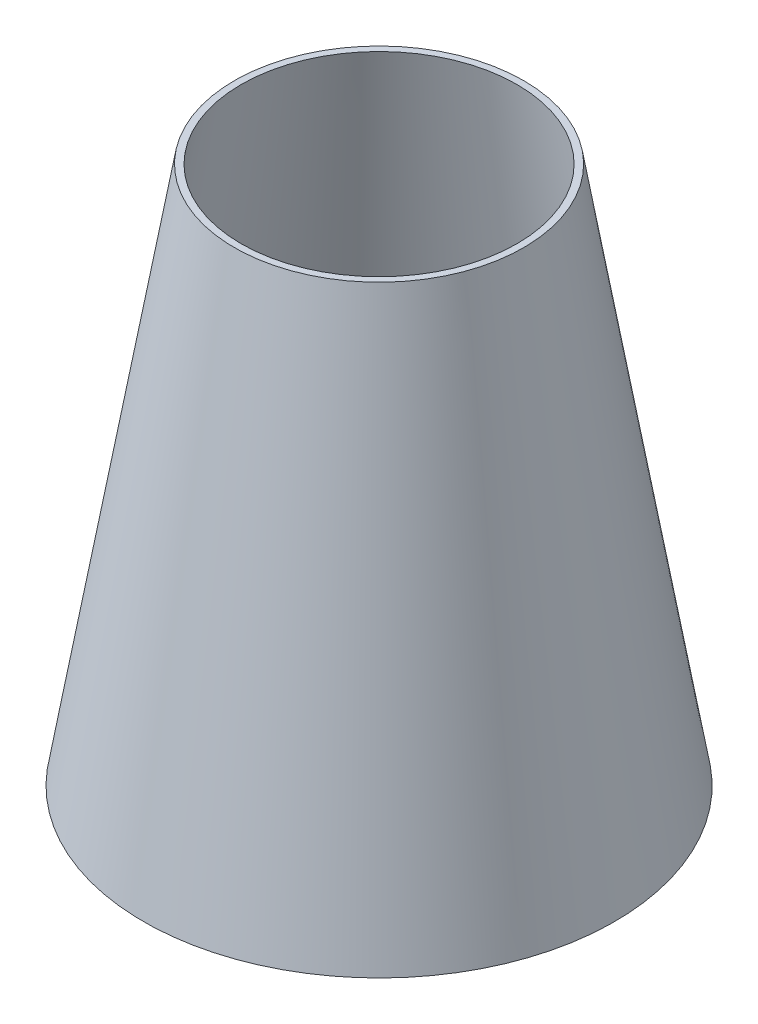
ISO-10303-21;
HEADER;
FILE_DESCRIPTION(('STEP AP214'),'2;1');
FILE_NAME('part.step','',(''),(''),'','','');
FILE_SCHEMA(('AUTOMOTIVE_DESIGN { 1 0 10303 214 1 1 1 1 }'));
ENDSEC;
DATA;
#1=APPLICATION_CONTEXT('core data for automotive mechanical design processes');
#2=APPLICATION_PROTOCOL_DEFINITION('international standard','automotive_design',2000,#1);
#3=PRODUCT_CONTEXT('',#1,'mechanical');
#4=PRODUCT('Part','Part','',(#3));
#5=PRODUCT_RELATED_PRODUCT_CATEGORY('part','',(#4));
#6=PRODUCT_DEFINITION_FORMATION('','',#4);
#7=PRODUCT_DEFINITION_CONTEXT('part definition',#1,'design');
#8=PRODUCT_DEFINITION('design','',#6,#7);
#9=PRODUCT_DEFINITION_SHAPE('','',#8);
#10=(LENGTH_UNIT() NAMED_UNIT(*) SI_UNIT(.MILLI.,.METRE.));
#11=(NAMED_UNIT(*) PLANE_ANGLE_UNIT() SI_UNIT($,.RADIAN.));
#12=(NAMED_UNIT(*) SI_UNIT($,.STERADIAN.) SOLID_ANGLE_UNIT());
#13=UNCERTAINTY_MEASURE_WITH_UNIT(LENGTH_MEASURE(1.E-05),#10,'distance_accuracy_value','');
#14=(GEOMETRIC_REPRESENTATION_CONTEXT(3) GLOBAL_UNCERTAINTY_ASSIGNED_CONTEXT((#13)) GLOBAL_UNIT_ASSIGNED_CONTEXT((#10,
#11,#12)) REPRESENTATION_CONTEXT('',''));
#15=CARTESIAN_POINT('',(0.,0.,0.));
#16=DIRECTION('',(0.,0.,1.));
#17=DIRECTION('',(1.,0.,0.));
#18=AXIS2_PLACEMENT_3D('',#15,#16,#17);
#19=CARTESIAN_POINT('',(-34.,0.,0.));
#20=DIRECTION('',(0.,-1.,0.));
#21=DIRECTION('',(0.,0.,-1.));
#22=AXIS2_PLACEMENT_3D('',#19,#20,#21);
#23=PLANE('',#22);
#24=CARTESIAN_POINT('',(0.,0.,0.));
#25=DIRECTION('',(0.,-1.,0.));
#26=DIRECTION('',(0.,0.,-1.));
#27=AXIS2_PLACEMENT_3D('',#24,#25,#26);
#28=CIRCLE('',#27,35.);
#29=CARTESIAN_POINT('',(0.,0.,-35.));
#30=VERTEX_POINT('',#29);
#31=EDGE_CURVE('E10',#30,#30,#28,.T.);
#32=ORIENTED_EDGE('',*,*,#31,.T.);
#33=EDGE_LOOP('',(#32));
#34=FACE_BOUND('',#33,.T.);
#35=CARTESIAN_POINT('',(0.,0.,0.));
#36=DIRECTION('',(0.,-1.,0.));
#37=DIRECTION('',(0.,0.,-1.));
#38=AXIS2_PLACEMENT_3D('',#35,#36,#37);
#39=CIRCLE('',#38,34.);
#40=CARTESIAN_POINT('',(0.,0.,-34.));
#41=VERTEX_POINT('',#40);
#42=EDGE_CURVE('E46',#41,#41,#39,.T.);
#43=ORIENTED_EDGE('',*,*,#42,.F.);
#44=EDGE_LOOP('',(#43));
#45=FACE_BOUND('',#44,.T.);
#46=ADVANCED_FACE('F32',(#34,#45),#23,.T.);
#47=CARTESIAN_POINT('',(0.,0.,0.));
#48=DIRECTION('',(0.,-1.,0.));
#49=DIRECTION('',(0.,0.,-1.));
#50=AXIS2_PLACEMENT_3D('',#47,#48,#49);
#51=CONICAL_SURFACE('',#50,35.,0.167175017093078);
#52=CARTESIAN_POINT('',(0.,80.,0.));
#53=DIRECTION('',(0.,-1.,0.));
#54=DIRECTION('',(0.,0.,-1.));
#55=AXIS2_PLACEMENT_3D('',#52,#53,#54);
#56=CIRCLE('',#55,21.5);
#57=CARTESIAN_POINT('',(0.,80.,-21.5));
#58=VERTEX_POINT('',#57);
#59=EDGE_CURVE('E38',#58,#58,#56,.T.);
#60=ORIENTED_EDGE('',*,*,#59,.T.);
#61=EDGE_LOOP('',(#60));
#62=FACE_BOUND('',#61,.T.);
#63=ORIENTED_EDGE('',*,*,#31,.F.);
#64=EDGE_LOOP('',(#63));
#65=FACE_BOUND('',#64,.T.);
#66=ADVANCED_FACE('F56',(#62,#65),#51,.T.);
#67=CARTESIAN_POINT('',(-21.5,80.,0.));
#68=DIRECTION('',(0.,1.,0.));
#69=DIRECTION('',(0.,0.,1.));
#70=AXIS2_PLACEMENT_3D('',#67,#68,#69);
#71=PLANE('',#70);
#72=CARTESIAN_POINT('',(0.,80.,0.));
#73=DIRECTION('',(0.,-1.,0.));
#74=DIRECTION('',(0.,0.,-1.));
#75=AXIS2_PLACEMENT_3D('',#72,#73,#74);
#76=CIRCLE('',#75,20.5);
#77=CARTESIAN_POINT('',(0.,80.,-20.5));
#78=VERTEX_POINT('',#77);
#79=EDGE_CURVE('E42',#78,#78,#76,.T.);
#80=ORIENTED_EDGE('',*,*,#79,.T.);
#81=EDGE_LOOP('',(#80));
#82=FACE_BOUND('',#81,.T.);
#83=ORIENTED_EDGE('',*,*,#59,.F.);
#84=EDGE_LOOP('',(#83));
#85=FACE_BOUND('',#84,.T.);
#86=ADVANCED_FACE('F60',(#82,#85),#71,.T.);
#87=CARTESIAN_POINT('',(0.,80.,0.));
#88=DIRECTION('',(0.,-1.,0.));
#89=DIRECTION('',(0.,0.,-1.));
#90=AXIS2_PLACEMENT_3D('',#87,#88,#89);
#91=CONICAL_SURFACE('',#90,20.5,0.167175017093078);
#92=ORIENTED_EDGE('',*,*,#42,.T.);
#93=EDGE_LOOP('',(#92));
#94=FACE_BOUND('',#93,.T.);
#95=ORIENTED_EDGE('',*,*,#79,.F.);
#96=EDGE_LOOP('',(#95));
#97=FACE_BOUND('',#96,.T.);
#98=ADVANCED_FACE('F52',(#94,#97),#91,.F.);
#99=CLOSED_SHELL('',(#46,#66,#86,#98));
#100=MANIFOLD_SOLID_BREP('B2',#99);
#101=ADVANCED_BREP_SHAPE_REPRESENTATION('',(#18,#100),#14);
#102=SHAPE_DEFINITION_REPRESENTATION(#9,#101);
ENDSEC;
END-ISO-10303-21;
